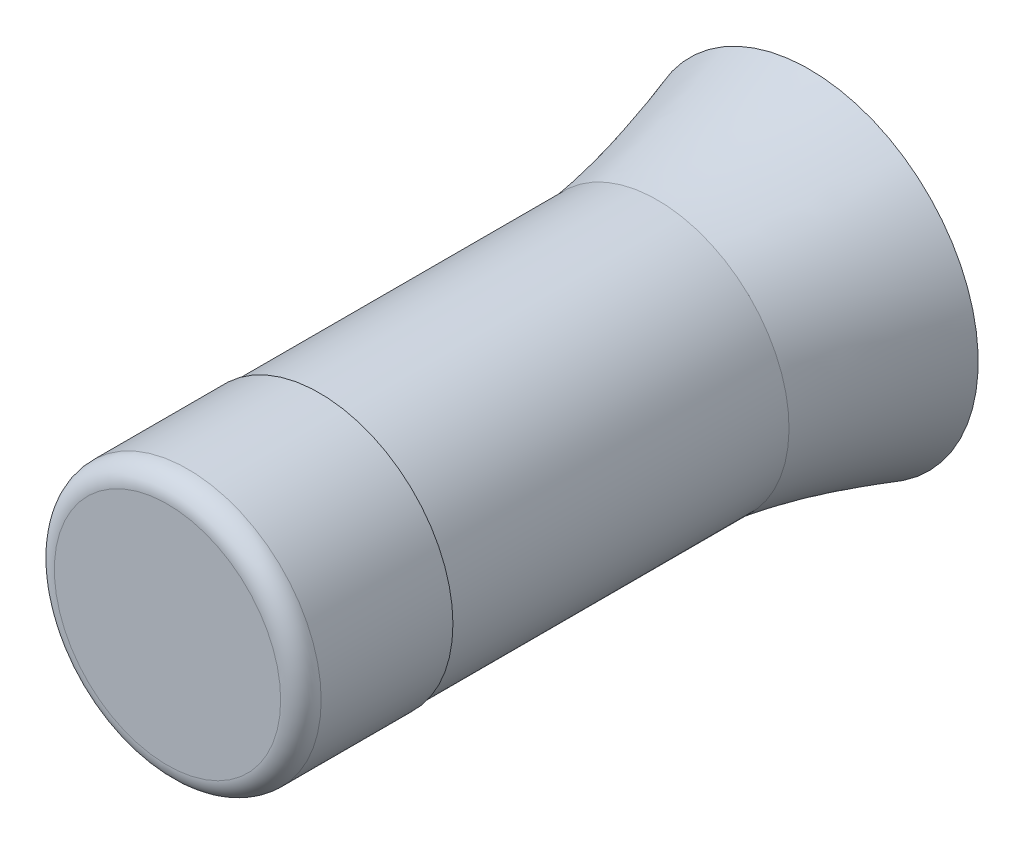
ISO-10303-21;
HEADER;
FILE_DESCRIPTION(('STEP AP214'),'2;1');
FILE_NAME('part.step','',(''),(''),'','','');
FILE_SCHEMA(('AUTOMOTIVE_DESIGN { 1 0 10303 214 1 1 1 1 }'));
ENDSEC;
DATA;
#1=APPLICATION_CONTEXT('core data for automotive mechanical design processes');
#2=APPLICATION_PROTOCOL_DEFINITION('international standard','automotive_design',2000,#1);
#3=PRODUCT_CONTEXT('',#1,'mechanical');
#4=PRODUCT('Part','Part','',(#3));
#5=PRODUCT_RELATED_PRODUCT_CATEGORY('part','',(#4));
#6=PRODUCT_DEFINITION_FORMATION('','',#4);
#7=PRODUCT_DEFINITION_CONTEXT('part definition',#1,'design');
#8=PRODUCT_DEFINITION('design','',#6,#7);
#9=PRODUCT_DEFINITION_SHAPE('','',#8);
#10=(LENGTH_UNIT() NAMED_UNIT(*) SI_UNIT(.MILLI.,.METRE.));
#11=(NAMED_UNIT(*) PLANE_ANGLE_UNIT() SI_UNIT($,.RADIAN.));
#12=(NAMED_UNIT(*) SI_UNIT($,.STERADIAN.) SOLID_ANGLE_UNIT());
#13=UNCERTAINTY_MEASURE_WITH_UNIT(LENGTH_MEASURE(1.E-05),#10,'distance_accuracy_value','');
#14=(GEOMETRIC_REPRESENTATION_CONTEXT(3) GLOBAL_UNCERTAINTY_ASSIGNED_CONTEXT((#13)) GLOBAL_UNIT_ASSIGNED_CONTEXT((#10,
#11,#12)) REPRESENTATION_CONTEXT('',''));
#15=CARTESIAN_POINT('',(0.,0.,0.));
#16=DIRECTION('',(0.,0.,1.));
#17=DIRECTION('',(1.,0.,0.));
#18=AXIS2_PLACEMENT_3D('',#15,#16,#17);
#19=CARTESIAN_POINT('',(0.,0.,5.));
#20=DIRECTION('',(0.,0.,-1.));
#21=DIRECTION('',(-1.,0.,0.));
#22=AXIS2_PLACEMENT_3D('',#19,#20,#21);
#23=CYLINDRICAL_SURFACE('',#22,1.95);
#24=CARTESIAN_POINT('',(0.,0.,5.));
#25=DIRECTION('',(0.,0.,1.));
#26=DIRECTION('',(1.,0.,0.));
#27=AXIS2_PLACEMENT_3D('',#24,#25,#26);
#28=CIRCLE('',#27,1.95);
#29=CARTESIAN_POINT('',(1.95,0.,5.));
#30=VERTEX_POINT('',#29);
#31=EDGE_CURVE('E46',#30,#30,#28,.T.);
#32=ORIENTED_EDGE('',*,*,#31,.F.);
#33=EDGE_LOOP('',(#32));
#34=FACE_BOUND('',#33,.T.);
#35=CARTESIAN_POINT('',(0.,0.,0.));
#36=DIRECTION('',(0.,0.,-1.));
#37=DIRECTION('',(-1.,0.,0.));
#38=AXIS2_PLACEMENT_3D('',#35,#36,#37);
#39=CIRCLE('',#38,1.95);
#40=CARTESIAN_POINT('',(1.3579095489477,1.39949335721062,0.));
#41=VERTEX_POINT('',#40);
#42=EDGE_CURVE('E57',#41,#41,#39,.T.);
#43=ORIENTED_EDGE('',*,*,#42,.F.);
#44=EDGE_LOOP('',(#43));
#45=FACE_BOUND('',#44,.T.);
#46=ADVANCED_FACE('F35',(#34,#45),#23,.T.);
#47=CARTESIAN_POINT('',(0.,0.,-2.25));
#48=DIRECTION('',(0.,0.,-1.));
#49=DIRECTION('',(-1.,0.,0.));
#50=AXIS2_PLACEMENT_3D('',#47,#48,#49);
#51=PLANE('',#50);
#52=CARTESIAN_POINT('',(0.,0.,-2.25));
#53=DIRECTION('',(0.,0.,-1.));
#54=DIRECTION('',(-1.,0.,0.));
#55=AXIS2_PLACEMENT_3D('',#52,#53,#54);
#56=CIRCLE('',#55,2.5);
#57=CARTESIAN_POINT('',(2.34137471687048,0.876335800478148,-2.25));
#58=VERTEX_POINT('',#57);
#59=EDGE_CURVE('E50',#58,#58,#56,.T.);
#60=ORIENTED_EDGE('',*,*,#59,.T.);
#61=EDGE_LOOP('',(#60));
#62=FACE_BOUND('',#61,.T.);
#63=ADVANCED_FACE('F63',(#62),#51,.T.);
#64=CARTESIAN_POINT('',(1.3579095489477,1.39949335721062,0.));
#65=CARTESIAN_POINT('',(2.34137471687048,0.876335800478148,-2.25));
#66=CARTESIAN_POINT('',(4.15689626336894,-1.31632574068478,0.));
#67=CARTESIAN_POINT('',(4.09404631782678,-3.80641363326282,-2.25));
#68=CARTESIAN_POINT('',(1.44107716547354,-4.11531245510602,0.));
#69=CARTESIAN_POINT('',(-0.588703115914188,-5.55908523421911,-2.25));
#70=CARTESIAN_POINT('',(-1.3579095489477,-1.39949335721062,0.));
#71=CARTESIAN_POINT('',(-2.34137471687048,-0.876335800478146,-2.25));
#72=CARTESIAN_POINT('',(-4.15689626336894,1.31632574068478,0.));
#73=CARTESIAN_POINT('',(-4.09404631782677,3.80641363326282,-2.25));
#74=CARTESIAN_POINT('',(-1.44107716547354,4.11531245510602,0.));
#75=CARTESIAN_POINT('',(0.588703115914191,5.55908523421911,-2.25));
#76=CARTESIAN_POINT('',(1.3579095489477,1.39949335721062,0.));
#77=CARTESIAN_POINT('',(2.34137471687048,0.876335800478148,-2.25));
#78=(BOUNDED_SURFACE() B_SPLINE_SURFACE(3,1,((#64,#65),(#66,#67),(#68,#69),(#70,#71),(#72,#73),
(#74,#75),(#76,#77)),.UNSPECIFIED.,.T.,.F.,.F.) B_SPLINE_SURFACE_WITH_KNOTS((4,3,4),(2,2),(0.,
0.5,1.),(0.,1.),.UNSPECIFIED.) GEOMETRIC_REPRESENTATION_ITEM() RATIONAL_B_SPLINE_SURFACE(((1.,
1.),(0.333333333333334,0.333333333333333),(0.333333333333334,0.333333333333333),(1.,1.),
(0.333333333333333,0.333333333333333),(0.333333333333333,0.333333333333333),(1.,1.))) REPRESENTATION_ITEM('') SURFACE());
#79=CARTESIAN_POINT('',(1.3579095489477,1.39949335721062,0.));
#80=CARTESIAN_POINT('',(1.36815397778023,1.39404379932799,-0.0234374999999999));
#81=CARTESIAN_POINT('',(1.37839840661276,1.38859424144536,-0.046875));
#82=CARTESIAN_POINT('',(1.39888726427782,1.3776951256801,-0.09375));
#83=CARTESIAN_POINT('',(1.40913169311035,1.37224556779747,-0.1171875));
#84=CARTESIAN_POINT('',(1.4296205507754,1.36134645203221,-0.1640625));
#85=CARTESIAN_POINT('',(1.43986497960793,1.35589689414958,-0.1875));
#86=CARTESIAN_POINT('',(1.46035383727299,1.34499777838432,-0.234375));
#87=CARTESIAN_POINT('',(1.47059826610552,1.33954822050169,-0.2578125));
#88=CARTESIAN_POINT('',(1.49108712377058,1.32864910473643,-0.3046875));
#89=CARTESIAN_POINT('',(1.50133155260311,1.3231995468538,-0.328125));
#90=CARTESIAN_POINT('',(1.52182041026816,1.31230043108854,-0.375));
#91=CARTESIAN_POINT('',(1.53206483910069,1.30685087320591,-0.3984375));
#92=CARTESIAN_POINT('',(1.55255369676575,1.29595175744065,-0.4453125));
#93=CARTESIAN_POINT('',(1.56279812559828,1.29050219955802,-0.46875));
#94=CARTESIAN_POINT('',(1.58328698326334,1.27960308379276,-0.515625));
#95=CARTESIAN_POINT('',(1.59353141209587,1.27415352591013,-0.5390625));
#96=CARTESIAN_POINT('',(1.61402026976092,1.26325441014487,-0.5859375));
#97=CARTESIAN_POINT('',(1.62426469859345,1.25780485226224,-0.609375));
#98=CARTESIAN_POINT('',(1.64475355625851,1.24690573649698,-0.65625));
#99=CARTESIAN_POINT('',(1.65499798509104,1.24145617861435,-0.6796875));
#100=CARTESIAN_POINT('',(1.6754868427561,1.23055706284909,-0.7265625));
#101=CARTESIAN_POINT('',(1.68573127158863,1.22510750496646,-0.75));
#102=CARTESIAN_POINT('',(1.70622012925369,1.2142083892012,-0.796875));
#103=CARTESIAN_POINT('',(1.71646455808621,1.20875883131857,-0.8203125));
#104=CARTESIAN_POINT('',(1.73695341575127,1.19785971555331,-0.8671875));
#105=CARTESIAN_POINT('',(1.7471978445838,1.19241015767068,-0.890625));
#106=CARTESIAN_POINT('',(1.76768670224886,1.18151104190542,-0.9375));
#107=CARTESIAN_POINT('',(1.77793113108139,1.17606148402279,-0.9609375));
#108=CARTESIAN_POINT('',(1.79841998874645,1.16516236825753,-1.0078125));
#109=CARTESIAN_POINT('',(1.80866441757897,1.1597128103749,-1.03125));
#110=CARTESIAN_POINT('',(1.82915327524403,1.14881369460964,-1.078125));
#111=CARTESIAN_POINT('',(1.83939770407656,1.14336413672701,-1.1015625));
#112=CARTESIAN_POINT('',(1.85988656174162,1.13246502096175,-1.1484375));
#113=CARTESIAN_POINT('',(1.87013099057415,1.12701546307912,-1.171875));
#114=CARTESIAN_POINT('',(1.89061984823921,1.11611634731386,-1.21875));
#115=CARTESIAN_POINT('',(1.90086427707174,1.11066678943123,-1.2421875));
#116=CARTESIAN_POINT('',(1.92135313473679,1.09976767366597,-1.2890625));
#117=CARTESIAN_POINT('',(1.93159756356932,1.09431811578334,-1.3125));
#118=CARTESIAN_POINT('',(1.95208642123438,1.08341900001808,-1.359375));
#119=CARTESIAN_POINT('',(1.96233085006691,1.07796944213546,-1.3828125));
#120=CARTESIAN_POINT('',(1.98281970773197,1.0670703263702,-1.4296875));
#121=CARTESIAN_POINT('',(1.9930641365645,1.06162076848756,-1.453125));
#122=CARTESIAN_POINT('',(2.01355299422955,1.05072165272231,-1.5));
#123=CARTESIAN_POINT('',(2.02379742306208,1.04527209483968,-1.5234375));
#124=CARTESIAN_POINT('',(2.04428628072714,1.03437297907442,-1.5703125));
#125=CARTESIAN_POINT('',(2.05453070955967,1.02892342119179,-1.59375));
#126=CARTESIAN_POINT('',(2.07501956722473,1.01802430542653,-1.640625));
#127=CARTESIAN_POINT('',(2.08526399605726,1.0125747475439,-1.6640625));
#128=CARTESIAN_POINT('',(2.10575285372231,1.00167563177864,-1.7109375));
#129=CARTESIAN_POINT('',(2.11599728255484,0.996226073896006,-1.734375));
#130=CARTESIAN_POINT('',(2.1364861402199,0.985326958130746,-1.78125));
#131=CARTESIAN_POINT('',(2.14673056905243,0.979877400248116,-1.8046875));
#132=CARTESIAN_POINT('',(2.16721942671749,0.968978284482856,-1.8515625));
#133=CARTESIAN_POINT('',(2.17746385555002,0.963528726600226,-1.875));
#134=CARTESIAN_POINT('',(2.19795271321507,0.952629610834966,-1.921875));
#135=CARTESIAN_POINT('',(2.2081971420476,0.947180052952337,-1.9453125));
#136=CARTESIAN_POINT('',(2.22868599971266,0.936280937187077,-1.9921875));
#137=CARTESIAN_POINT('',(2.23893042854519,0.930831379304447,-2.015625));
#138=CARTESIAN_POINT('',(2.25941928621025,0.919932263539187,-2.0625));
#139=CARTESIAN_POINT('',(2.26966371504278,0.914482705656557,-2.0859375));
#140=CARTESIAN_POINT('',(2.29015257270784,0.903583589891297,-2.1328125));
#141=CARTESIAN_POINT('',(2.30039700154036,0.898134032008667,-2.15625));
#142=CARTESIAN_POINT('',(2.32088585920542,0.887234916243407,-2.203125));
#143=CARTESIAN_POINT('',(2.33113028803795,0.881785358360777,-2.2265625));
#144=CARTESIAN_POINT('',(2.34137471687048,0.876335800478148,-2.25));
#145=B_SPLINE_CURVE_WITH_KNOTS('',3,(#79,#80,#81,#82,#83,#84,#85,#86,#87,#88,#89,#90,#91,#92,
#93,#94,#95,#96,#97,#98,#99,#100,#101,#102,#103,#104,#105,#106,#107,#108,#109,#110,#111,#112,
#113,#114,#115,#116,#117,#118,#119,#120,#121,#122,#123,#124,#125,#126,#127,#128,#129,#130,#131,
#132,#133,#134,#135,#136,#137,#138,#139,#140,#141,#142,#143,#144),.UNSPECIFIED.,.F.,.F.,(4,2,2,
2,2,2,2,2,2,2,2,2,2,2,2,2,2,2,2,2,2,2,2,2,2,2,2,2,2,2,2,2,4),(0.,0.0784580249894042,
0.156916049978808,0.235374074968212,0.313832099957616,0.392290124947021,0.470748149936425,
0.549206174925829,0.627664199915233,0.706122224904637,0.784580249894041,0.863038274883445,
0.941496299872849,1.01995432486225,1.09841234985166,1.17687037484106,1.25532839983047,
1.33378642481987,1.41224444980927,1.49070247479868,1.56916049978808,1.64761852477749,
1.72607654976689,1.80453457475629,1.8829925997457,1.9614506247351,2.03990864972451,
2.11836667471391,2.19682469970332,2.27528272469272,2.35374074968212,2.43219877467153,
2.51065679966093),.UNSPECIFIED.);
#146=EDGE_CURVE('BSEAM72',#41,#58,#145,.T.);
#147=ORIENTED_EDGE('',*,*,#42,.T.);
#148=ORIENTED_EDGE('',*,*,#59,.F.);
#149=ORIENTED_EDGE('',*,*,#146,.T.);
#150=ORIENTED_EDGE('',*,*,#146,.F.);
#151=EDGE_LOOP('',(#147,#149,#148,#150));
#152=FACE_BOUND('',#151,.T.);
#153=ADVANCED_FACE('F72',(#152),#78,.T.);
#154=CARTESIAN_POINT('',(0.,0.,7.25));
#155=DIRECTION('',(0.,0.,-1.));
#156=DIRECTION('',(-1.,0.,0.));
#157=AXIS2_PLACEMENT_3D('',#154,#155,#156);
#158=CYLINDRICAL_SURFACE('',#157,1.975);
#159=CARTESIAN_POINT('',(0.,0.,6.95));
#160=DIRECTION('',(0.,0.,1.));
#161=DIRECTION('',(1.,0.,0.));
#162=AXIS2_PLACEMENT_3D('',#159,#160,#161);
#163=CIRCLE('',#162,1.975);
#164=CARTESIAN_POINT('',(1.975,0.,6.95));
#165=VERTEX_POINT('',#164);
#166=EDGE_CURVE('E11',#165,#165,#163,.F.);
#167=ORIENTED_EDGE('',*,*,#166,.T.);
#168=EDGE_LOOP('',(#167));
#169=FACE_BOUND('',#168,.T.);
#170=CARTESIAN_POINT('',(0.,0.,5.));
#171=DIRECTION('',(0.,0.,1.));
#172=DIRECTION('',(1.,0.,0.));
#173=AXIS2_PLACEMENT_3D('',#170,#171,#172);
#174=CIRCLE('',#173,1.975);
#175=CARTESIAN_POINT('',(1.975,0.,5.));
#176=VERTEX_POINT('',#175);
#177=EDGE_CURVE('E87',#176,#176,#174,.T.);
#178=ORIENTED_EDGE('',*,*,#177,.T.);
#179=EDGE_LOOP('',(#178));
#180=FACE_BOUND('',#179,.T.);
#181=ADVANCED_FACE('F102',(#169,#180),#158,.T.);
#182=CARTESIAN_POINT('',(0.,0.,7.25));
#183=DIRECTION('',(0.,0.,1.));
#184=DIRECTION('',(1.,0.,0.));
#185=AXIS2_PLACEMENT_3D('',#182,#183,#184);
#186=PLANE('',#185);
#187=CARTESIAN_POINT('',(0.,0.,7.25));
#188=DIRECTION('',(0.,0.,1.));
#189=DIRECTION('',(1.,0.,0.));
#190=AXIS2_PLACEMENT_3D('',#187,#188,#189);
#191=CIRCLE('',#190,1.675);
#192=CARTESIAN_POINT('',(1.675,0.,7.25));
#193=VERTEX_POINT('',#192);
#194=EDGE_CURVE('E42',#193,#193,#191,.T.);
#195=ORIENTED_EDGE('',*,*,#194,.T.);
#196=EDGE_LOOP('',(#195));
#197=FACE_BOUND('',#196,.T.);
#198=ADVANCED_FACE('F107',(#197),#186,.T.);
#199=CARTESIAN_POINT('',(0.,0.,5.));
#200=DIRECTION('',(0.,0.,1.));
#201=DIRECTION('',(1.,0.,0.));
#202=AXIS2_PLACEMENT_3D('',#199,#200,#201);
#203=PLANE('',#202);
#204=ORIENTED_EDGE('',*,*,#31,.T.);
#205=EDGE_LOOP('',(#204));
#206=FACE_BOUND('',#205,.T.);
#207=ORIENTED_EDGE('',*,*,#177,.F.);
#208=EDGE_LOOP('',(#207));
#209=FACE_BOUND('',#208,.T.);
#210=ADVANCED_FACE('F111',(#206,#209),#203,.F.);
#211=CARTESIAN_POINT('',(0.,0.,6.95));
#212=DIRECTION('',(0.,0.,1.));
#213=DIRECTION('',(1.,0.,0.));
#214=AXIS2_PLACEMENT_3D('',#211,#212,#213);
#215=TOROIDAL_SURFACE('',#214,1.675,0.3);
#216=ORIENTED_EDGE('',*,*,#166,.F.);
#217=EDGE_LOOP('',(#216));
#218=FACE_BOUND('',#217,.T.);
#219=ORIENTED_EDGE('',*,*,#194,.F.);
#220=EDGE_LOOP('',(#219));
#221=FACE_BOUND('',#220,.T.);
#222=ADVANCED_FACE('F37',(#218,#221),#215,.T.);
#223=CLOSED_SHELL('',(#46,#63,#153,#181,#198,#210,#222));
#224=MANIFOLD_SOLID_BREP('B2',#223);
#225=ADVANCED_BREP_SHAPE_REPRESENTATION('',(#18,#224),#14);
#226=SHAPE_DEFINITION_REPRESENTATION(#9,#225);
ENDSEC;
END-ISO-10303-21;
